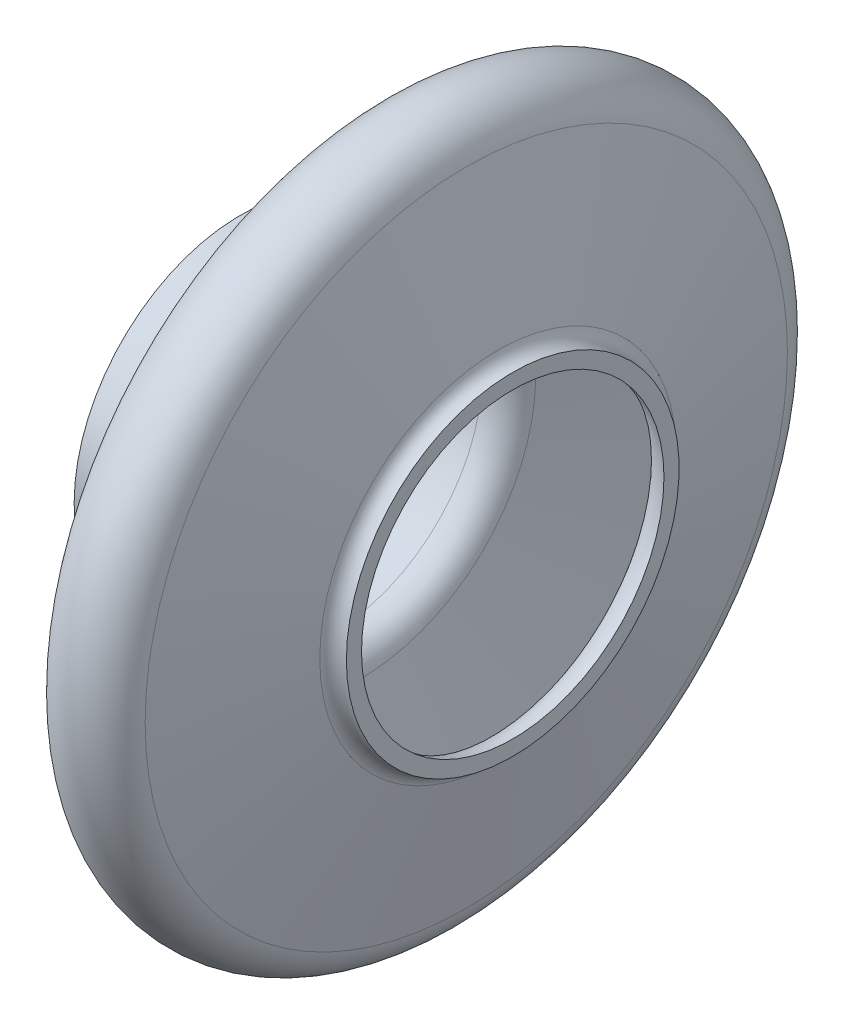
ISO-10303-21;
HEADER;
FILE_DESCRIPTION(('STEP AP214'),'2;1');
FILE_NAME('part.step','',(''),(''),'','','');
FILE_SCHEMA(('AUTOMOTIVE_DESIGN { 1 0 10303 214 1 1 1 1 }'));
ENDSEC;
DATA;
#1=APPLICATION_CONTEXT('core data for automotive mechanical design processes');
#2=APPLICATION_PROTOCOL_DEFINITION('international standard','automotive_design',2000,#1);
#3=PRODUCT_CONTEXT('',#1,'mechanical');
#4=PRODUCT('Part','Part','',(#3));
#5=PRODUCT_RELATED_PRODUCT_CATEGORY('part','',(#4));
#6=PRODUCT_DEFINITION_FORMATION('','',#4);
#7=PRODUCT_DEFINITION_CONTEXT('part definition',#1,'design');
#8=PRODUCT_DEFINITION('design','',#6,#7);
#9=PRODUCT_DEFINITION_SHAPE('','',#8);
#10=(LENGTH_UNIT() NAMED_UNIT(*) SI_UNIT(.MILLI.,.METRE.));
#11=(NAMED_UNIT(*) PLANE_ANGLE_UNIT() SI_UNIT($,.RADIAN.));
#12=(NAMED_UNIT(*) SI_UNIT($,.STERADIAN.) SOLID_ANGLE_UNIT());
#13=UNCERTAINTY_MEASURE_WITH_UNIT(LENGTH_MEASURE(1.E-05),#10,'distance_accuracy_value','');
#14=(GEOMETRIC_REPRESENTATION_CONTEXT(3) GLOBAL_UNCERTAINTY_ASSIGNED_CONTEXT((#13)) GLOBAL_UNIT_ASSIGNED_CONTEXT((#10,
#11,#12)) REPRESENTATION_CONTEXT('',''));
#15=CARTESIAN_POINT('',(0.,0.,0.));
#16=DIRECTION('',(0.,0.,1.));
#17=DIRECTION('',(1.,0.,0.));
#18=AXIS2_PLACEMENT_3D('',#15,#16,#17);
#19=CARTESIAN_POINT('',(0.,0.,0.));
#20=DIRECTION('',(-1.,0.,0.));
#21=DIRECTION('',(0.,0.,1.));
#22=AXIS2_PLACEMENT_3D('',#19,#20,#21);
#23=CYLINDRICAL_SURFACE('',#22,11.);
#24=CARTESIAN_POINT('',(-72.,0.,0.));
#25=DIRECTION('',(-1.,0.,0.));
#26=DIRECTION('',(0.,0.,1.));
#27=AXIS2_PLACEMENT_3D('',#24,#25,#26);
#28=CIRCLE('',#27,11.);
#29=CARTESIAN_POINT('',(-72.,0.,11.));
#30=VERTEX_POINT('',#29);
#31=EDGE_CURVE('E102',#30,#30,#28,.T.);
#32=ORIENTED_EDGE('',*,*,#31,.F.);
#33=EDGE_LOOP('',(#32));
#34=FACE_BOUND('',#33,.T.);
#35=CARTESIAN_POINT('',(-66.,0.,0.));
#36=DIRECTION('',(-1.,0.,0.));
#37=DIRECTION('',(0.,0.,1.));
#38=AXIS2_PLACEMENT_3D('',#35,#36,#37);
#39=CIRCLE('',#38,11.);
#40=CARTESIAN_POINT('',(-66.,0.,11.));
#41=VERTEX_POINT('',#40);
#42=EDGE_CURVE('E10',#41,#41,#39,.T.);
#43=ORIENTED_EDGE('',*,*,#42,.T.);
#44=EDGE_LOOP('',(#43));
#45=FACE_BOUND('',#44,.T.);
#46=ADVANCED_FACE('F43',(#34,#45),#23,.T.);
#47=CARTESIAN_POINT('',(-66.,0.,0.));
#48=DIRECTION('',(-1.,0.,0.));
#49=DIRECTION('',(0.,0.,1.));
#50=AXIS2_PLACEMENT_3D('',#47,#48,#49);
#51=TOROIDAL_SURFACE('',#50,12.,1.);
#52=ORIENTED_EDGE('',*,*,#42,.F.);
#53=EDGE_LOOP('',(#52));
#54=FACE_BOUND('',#53,.T.);
#55=CARTESIAN_POINT('',(-65.0237039928801,0.,0.));
#56=DIRECTION('',(-1.,0.,0.));
#57=DIRECTION('',(0.,0.,1.));
#58=AXIS2_PLACEMENT_3D('',#55,#56,#57);
#59=CIRCLE('',#58,11.7835603860619);
#60=CARTESIAN_POINT('',(-65.0237039928801,0.,11.7835603860619));
#61=VERTEX_POINT('',#60);
#62=EDGE_CURVE('E50',#61,#61,#59,.T.);
#63=ORIENTED_EDGE('',*,*,#62,.T.);
#64=EDGE_LOOP('',(#63));
#65=FACE_BOUND('',#64,.T.);
#66=ADVANCED_FACE('F111',(#54,#65),#51,.F.);
#67=CARTESIAN_POINT('',(-62.9288880213598,0.,0.));
#68=DIRECTION('',(1.,0.,0.));
#69=DIRECTION('',(0.,0.,-1.));
#70=AXIS2_PLACEMENT_3D('',#67,#68,#69);
#71=CONICAL_SURFACE('',#70,21.2326646024054,1.3526301702956);
#72=ORIENTED_EDGE('',*,*,#62,.F.);
#73=EDGE_LOOP('',(#72));
#74=FACE_BOUND('',#73,.T.);
#75=CARTESIAN_POINT('',(-62.9288880213598,0.,0.));
#76=DIRECTION('',(-1.,0.,0.));
#77=DIRECTION('',(0.,0.,1.));
#78=AXIS2_PLACEMENT_3D('',#75,#76,#77);
#79=CIRCLE('',#78,21.2326646024054);
#80=CARTESIAN_POINT('',(-62.9288880213598,0.,21.2326646024054));
#81=VERTEX_POINT('',#80);
#82=EDGE_CURVE('E55',#81,#81,#79,.T.);
#83=ORIENTED_EDGE('',*,*,#82,.T.);
#84=EDGE_LOOP('',(#83));
#85=FACE_BOUND('',#84,.T.);
#86=ADVANCED_FACE('F115',(#74,#85),#71,.T.);
#87=CARTESIAN_POINT('',(-60.,0.,0.));
#88=DIRECTION('',(-1.,0.,0.));
#89=DIRECTION('',(0.,0.,1.));
#90=AXIS2_PLACEMENT_3D('',#87,#88,#89);
#91=TOROIDAL_SURFACE('',#90,20.5833457605911,3.);
#92=ORIENTED_EDGE('',*,*,#82,.F.);
#93=EDGE_LOOP('',(#92));
#94=FACE_BOUND('',#93,.T.);
#95=CARTESIAN_POINT('',(-57.0711119786402,0.,0.));
#96=DIRECTION('',(-1.,0.,0.));
#97=DIRECTION('',(0.,0.,1.));
#98=AXIS2_PLACEMENT_3D('',#95,#96,#97);
#99=CIRCLE('',#98,21.2326646024054);
#100=CARTESIAN_POINT('',(-57.0711119786402,0.,21.2326646024054));
#101=VERTEX_POINT('',#100);
#102=EDGE_CURVE('E60',#101,#101,#99,.T.);
#103=ORIENTED_EDGE('',*,*,#102,.T.);
#104=EDGE_LOOP('',(#103));
#105=FACE_BOUND('',#104,.T.);
#106=ADVANCED_FACE('F120',(#94,#105),#91,.T.);
#107=CARTESIAN_POINT('',(-54.9762960071199,0.,0.));
#108=DIRECTION('',(-1.,0.,0.));
#109=DIRECTION('',(0.,0.,1.));
#110=AXIS2_PLACEMENT_3D('',#107,#108,#109);
#111=CONICAL_SURFACE('',#110,11.7835603860619,1.3526301702956);
#112=ORIENTED_EDGE('',*,*,#102,.F.);
#113=EDGE_LOOP('',(#112));
#114=FACE_BOUND('',#113,.T.);
#115=CARTESIAN_POINT('',(-54.9762960071199,0.,0.));
#116=DIRECTION('',(-1.,0.,0.));
#117=DIRECTION('',(0.,0.,1.));
#118=AXIS2_PLACEMENT_3D('',#115,#116,#117);
#119=CIRCLE('',#118,11.7835603860619);
#120=CARTESIAN_POINT('',(-54.9762960071199,0.,11.7835603860619));
#121=VERTEX_POINT('',#120);
#122=EDGE_CURVE('E66',#121,#121,#119,.T.);
#123=ORIENTED_EDGE('',*,*,#122,.T.);
#124=EDGE_LOOP('',(#123));
#125=FACE_BOUND('',#124,.T.);
#126=ADVANCED_FACE('F126',(#114,#125),#111,.T.);
#127=CARTESIAN_POINT('',(-54.,0.,0.));
#128=DIRECTION('',(-1.,0.,0.));
#129=DIRECTION('',(0.,0.,1.));
#130=AXIS2_PLACEMENT_3D('',#127,#128,#129);
#131=TOROIDAL_SURFACE('',#130,12.,1.);
#132=ORIENTED_EDGE('',*,*,#122,.F.);
#133=EDGE_LOOP('',(#132));
#134=FACE_BOUND('',#133,.T.);
#135=CARTESIAN_POINT('',(-54.,0.,0.));
#136=DIRECTION('',(-1.,0.,0.));
#137=DIRECTION('',(0.,0.,1.));
#138=AXIS2_PLACEMENT_3D('',#135,#136,#137);
#139=CIRCLE('',#138,11.);
#140=CARTESIAN_POINT('',(-54.,0.,11.));
#141=VERTEX_POINT('',#140);
#142=EDGE_CURVE('E70',#141,#141,#139,.T.);
#143=ORIENTED_EDGE('',*,*,#142,.T.);
#144=EDGE_LOOP('',(#143));
#145=FACE_BOUND('',#144,.T.);
#146=ADVANCED_FACE('F130',(#134,#145),#131,.F.);
#147=CARTESIAN_POINT('',(-54.,0.,-11.));
#148=DIRECTION('',(1.,0.,0.));
#149=DIRECTION('',(0.,0.,-1.));
#150=AXIS2_PLACEMENT_3D('',#147,#148,#149);
#151=PLANE('',#150);
#152=CARTESIAN_POINT('',(-54.,0.,0.));
#153=DIRECTION('',(-1.,0.,0.));
#154=DIRECTION('',(0.,0.,1.));
#155=AXIS2_PLACEMENT_3D('',#152,#153,#154);
#156=CIRCLE('',#155,10.);
#157=CARTESIAN_POINT('',(-54.,0.,10.));
#158=VERTEX_POINT('',#157);
#159=EDGE_CURVE('E74',#158,#158,#156,.T.);
#160=ORIENTED_EDGE('',*,*,#159,.T.);
#161=EDGE_LOOP('',(#160));
#162=FACE_BOUND('',#161,.T.);
#163=ORIENTED_EDGE('',*,*,#142,.F.);
#164=EDGE_LOOP('',(#163));
#165=FACE_BOUND('',#164,.T.);
#166=ADVANCED_FACE('F134',(#162,#165),#151,.T.);
#167=CARTESIAN_POINT('',(-54.,0.,0.));
#168=DIRECTION('',(-1.,0.,0.));
#169=DIRECTION('',(0.,0.,1.));
#170=AXIS2_PLACEMENT_3D('',#167,#168,#169);
#171=TOROIDAL_SURFACE('',#170,12.,2.);
#172=CARTESIAN_POINT('',(-55.9525920142399,0.,0.));
#173=DIRECTION('',(-1.,0.,0.));
#174=DIRECTION('',(0.,0.,1.));
#175=AXIS2_PLACEMENT_3D('',#172,#173,#174);
#176=CIRCLE('',#175,11.5671207721238);
#177=CARTESIAN_POINT('',(-55.9525920142399,0.,11.5671207721238));
#178=VERTEX_POINT('',#177);
#179=EDGE_CURVE('E78',#178,#178,#176,.T.);
#180=ORIENTED_EDGE('',*,*,#179,.T.);
#181=EDGE_LOOP('',(#180));
#182=FACE_BOUND('',#181,.T.);
#183=ORIENTED_EDGE('',*,*,#159,.F.);
#184=EDGE_LOOP('',(#183));
#185=FACE_BOUND('',#184,.T.);
#186=ADVANCED_FACE('F138',(#182,#185),#171,.T.);
#187=CARTESIAN_POINT('',(-55.9525920142399,0.,0.));
#188=DIRECTION('',(-1.,0.,0.));
#189=DIRECTION('',(0.,0.,1.));
#190=AXIS2_PLACEMENT_3D('',#187,#188,#189);
#191=CONICAL_SURFACE('',#190,11.5671207721238,1.3526301702956);
#192=CARTESIAN_POINT('',(-58.0474079857601,0.,0.));
#193=DIRECTION('',(-1.,0.,0.));
#194=DIRECTION('',(0.,0.,1.));
#195=AXIS2_PLACEMENT_3D('',#192,#193,#194);
#196=CIRCLE('',#195,21.0162249884673);
#197=CARTESIAN_POINT('',(-58.0474079857601,0.,21.0162249884673));
#198=VERTEX_POINT('',#197);
#199=EDGE_CURVE('E82',#198,#198,#196,.T.);
#200=ORIENTED_EDGE('',*,*,#199,.T.);
#201=EDGE_LOOP('',(#200));
#202=FACE_BOUND('',#201,.T.);
#203=ORIENTED_EDGE('',*,*,#179,.F.);
#204=EDGE_LOOP('',(#203));
#205=FACE_BOUND('',#204,.T.);
#206=ADVANCED_FACE('F142',(#202,#205),#191,.F.);
#207=CARTESIAN_POINT('',(-60.,0.,0.));
#208=DIRECTION('',(-1.,0.,0.));
#209=DIRECTION('',(0.,0.,1.));
#210=AXIS2_PLACEMENT_3D('',#207,#208,#209);
#211=TOROIDAL_SURFACE('',#210,20.5833457605911,2.);
#212=CARTESIAN_POINT('',(-61.9525920142399,0.,0.));
#213=DIRECTION('',(-1.,0.,0.));
#214=DIRECTION('',(0.,0.,1.));
#215=AXIS2_PLACEMENT_3D('',#212,#213,#214);
#216=CIRCLE('',#215,21.0162249884673);
#217=CARTESIAN_POINT('',(-61.9525920142399,0.,21.0162249884673));
#218=VERTEX_POINT('',#217);
#219=EDGE_CURVE('E86',#218,#218,#216,.T.);
#220=ORIENTED_EDGE('',*,*,#219,.T.);
#221=EDGE_LOOP('',(#220));
#222=FACE_BOUND('',#221,.T.);
#223=ORIENTED_EDGE('',*,*,#199,.F.);
#224=EDGE_LOOP('',(#223));
#225=FACE_BOUND('',#224,.T.);
#226=ADVANCED_FACE('F146',(#222,#225),#211,.F.);
#227=CARTESIAN_POINT('',(-61.9525920142399,0.,0.));
#228=DIRECTION('',(1.,0.,0.));
#229=DIRECTION('',(0.,0.,-1.));
#230=AXIS2_PLACEMENT_3D('',#227,#228,#229);
#231=CONICAL_SURFACE('',#230,21.0162249884673,1.3526301702956);
#232=CARTESIAN_POINT('',(-64.0474079857601,0.,0.));
#233=DIRECTION('',(-1.,0.,0.));
#234=DIRECTION('',(0.,0.,1.));
#235=AXIS2_PLACEMENT_3D('',#232,#233,#234);
#236=CIRCLE('',#235,11.5671207721238);
#237=CARTESIAN_POINT('',(-64.0474079857601,0.,11.5671207721238));
#238=VERTEX_POINT('',#237);
#239=EDGE_CURVE('E90',#238,#238,#236,.T.);
#240=ORIENTED_EDGE('',*,*,#239,.T.);
#241=EDGE_LOOP('',(#240));
#242=FACE_BOUND('',#241,.T.);
#243=ORIENTED_EDGE('',*,*,#219,.F.);
#244=EDGE_LOOP('',(#243));
#245=FACE_BOUND('',#244,.T.);
#246=ADVANCED_FACE('F150',(#242,#245),#231,.F.);
#247=CARTESIAN_POINT('',(-66.,0.,0.));
#248=DIRECTION('',(-1.,0.,0.));
#249=DIRECTION('',(0.,0.,1.));
#250=AXIS2_PLACEMENT_3D('',#247,#248,#249);
#251=TOROIDAL_SURFACE('',#250,12.,2.);
#252=CARTESIAN_POINT('',(-66.,0.,0.));
#253=DIRECTION('',(-1.,0.,0.));
#254=DIRECTION('',(0.,0.,1.));
#255=AXIS2_PLACEMENT_3D('',#252,#253,#254);
#256=CIRCLE('',#255,10.);
#257=CARTESIAN_POINT('',(-66.,0.,10.));
#258=VERTEX_POINT('',#257);
#259=EDGE_CURVE('E94',#258,#258,#256,.T.);
#260=ORIENTED_EDGE('',*,*,#259,.T.);
#261=EDGE_LOOP('',(#260));
#262=FACE_BOUND('',#261,.T.);
#263=ORIENTED_EDGE('',*,*,#239,.F.);
#264=EDGE_LOOP('',(#263));
#265=FACE_BOUND('',#264,.T.);
#266=ADVANCED_FACE('F154',(#262,#265),#251,.T.);
#267=CARTESIAN_POINT('',(0.,0.,0.));
#268=DIRECTION('',(-1.,0.,0.));
#269=DIRECTION('',(0.,0.,1.));
#270=AXIS2_PLACEMENT_3D('',#267,#268,#269);
#271=CYLINDRICAL_SURFACE('',#270,10.);
#272=CARTESIAN_POINT('',(-72.,0.,0.));
#273=DIRECTION('',(-1.,0.,0.));
#274=DIRECTION('',(0.,0.,1.));
#275=AXIS2_PLACEMENT_3D('',#272,#273,#274);
#276=CIRCLE('',#275,9.99999999999999);
#277=CARTESIAN_POINT('',(-72.,0.,9.99999999999999));
#278=VERTEX_POINT('',#277);
#279=EDGE_CURVE('E98',#278,#278,#276,.T.);
#280=ORIENTED_EDGE('',*,*,#279,.T.);
#281=EDGE_LOOP('',(#280));
#282=FACE_BOUND('',#281,.T.);
#283=ORIENTED_EDGE('',*,*,#259,.F.);
#284=EDGE_LOOP('',(#283));
#285=FACE_BOUND('',#284,.T.);
#286=ADVANCED_FACE('F158',(#282,#285),#271,.F.);
#287=CARTESIAN_POINT('',(-72.,0.,-9.99999999999999));
#288=DIRECTION('',(-1.,0.,0.));
#289=DIRECTION('',(0.,0.,1.));
#290=AXIS2_PLACEMENT_3D('',#287,#288,#289);
#291=PLANE('',#290);
#292=ORIENTED_EDGE('',*,*,#31,.T.);
#293=EDGE_LOOP('',(#292));
#294=FACE_BOUND('',#293,.T.);
#295=ORIENTED_EDGE('',*,*,#279,.F.);
#296=EDGE_LOOP('',(#295));
#297=FACE_BOUND('',#296,.T.);
#298=ADVANCED_FACE('F107',(#294,#297),#291,.T.);
#299=CLOSED_SHELL('',(#46,#66,#86,#106,#126,#146,#166,#186,#206,#226,#246,#266,#286,#298));
#300=MANIFOLD_SOLID_BREP('B2',#299);
#301=ADVANCED_BREP_SHAPE_REPRESENTATION('',(#18,#300),#14);
#302=SHAPE_DEFINITION_REPRESENTATION(#9,#301);
ENDSEC;
END-ISO-10303-21;
